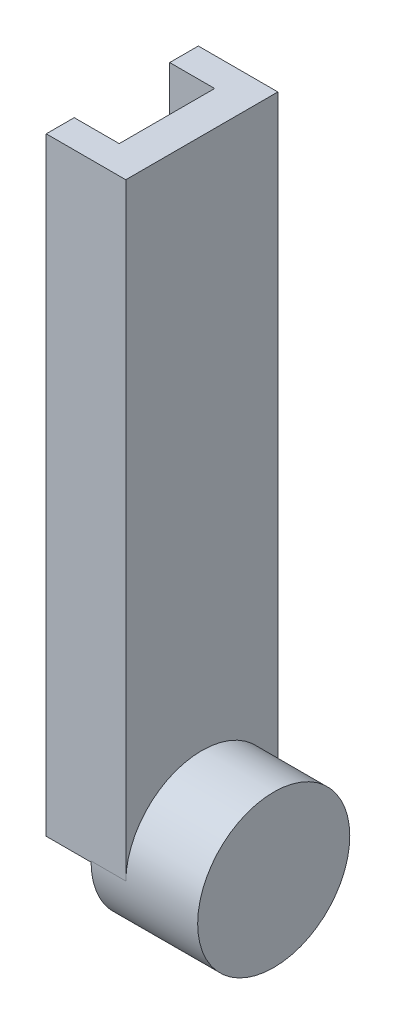
ISO-10303-21;
HEADER;
FILE_DESCRIPTION(('STEP AP214'),'2;1');
FILE_NAME('part.step','',(''),(''),'','','');
FILE_SCHEMA(('AUTOMOTIVE_DESIGN { 1 0 10303 214 1 1 1 1 }'));
ENDSEC;
DATA;
#1=APPLICATION_CONTEXT('core data for automotive mechanical design processes');
#2=APPLICATION_PROTOCOL_DEFINITION('international standard','automotive_design',2000,#1);
#3=PRODUCT_CONTEXT('',#1,'mechanical');
#4=PRODUCT('Part','Part','',(#3));
#5=PRODUCT_RELATED_PRODUCT_CATEGORY('part','',(#4));
#6=PRODUCT_DEFINITION_FORMATION('','',#4);
#7=PRODUCT_DEFINITION_CONTEXT('part definition',#1,'design');
#8=PRODUCT_DEFINITION('design','',#6,#7);
#9=PRODUCT_DEFINITION_SHAPE('','',#8);
#10=(LENGTH_UNIT() NAMED_UNIT(*) SI_UNIT(.MILLI.,.METRE.));
#11=(NAMED_UNIT(*) PLANE_ANGLE_UNIT() SI_UNIT($,.RADIAN.));
#12=(NAMED_UNIT(*) SI_UNIT($,.STERADIAN.) SOLID_ANGLE_UNIT());
#13=UNCERTAINTY_MEASURE_WITH_UNIT(LENGTH_MEASURE(1.E-05),#10,'distance_accuracy_value','');
#14=(GEOMETRIC_REPRESENTATION_CONTEXT(3) GLOBAL_UNCERTAINTY_ASSIGNED_CONTEXT((#13)) GLOBAL_UNIT_ASSIGNED_CONTEXT((#10,
#11,#12)) REPRESENTATION_CONTEXT('',''));
#15=CARTESIAN_POINT('',(0.,0.,0.));
#16=DIRECTION('',(0.,0.,1.));
#17=DIRECTION('',(1.,0.,0.));
#18=AXIS2_PLACEMENT_3D('',#15,#16,#17);
#19=CARTESIAN_POINT('',(14.,0.,0.));
#20=DIRECTION('',(-1.,0.,0.));
#21=DIRECTION('',(0.,0.,1.));
#22=AXIS2_PLACEMENT_3D('',#19,#20,#21);
#23=CYLINDRICAL_SURFACE('',#22,10.);
#24=CARTESIAN_POINT('',(14.,0.,0.));
#25=DIRECTION('',(1.,0.,0.));
#26=DIRECTION('',(0.,0.,-1.));
#27=AXIS2_PLACEMENT_3D('',#24,#25,#26);
#28=CIRCLE('',#27,10.);
#29=CARTESIAN_POINT('',(14.,0.,-10.));
#30=VERTEX_POINT('',#29);
#31=EDGE_CURVE('E168',#30,#30,#28,.T.);
#32=ORIENTED_EDGE('',*,*,#31,.F.);
#33=EDGE_LOOP('',(#32));
#34=FACE_BOUND('',#33,.T.);
#35=DIRECTION('',(-1.,0.,0.));
#36=VECTOR('',#35,1.);
#37=CARTESIAN_POINT('',(14.,0.137682640429803,9.9990521296033));
#38=LINE('',#37,#36);
#39=CARTESIAN_POINT('',(0.,0.137682640429803,9.9990521296033));
#40=VERTEX_POINT('',#39);
#41=CARTESIAN_POINT('',(4.54592595497942,0.137682640429806,9.9990521296033));
#42=VERTEX_POINT('',#41);
#43=EDGE_CURVE('E165',#40,#42,#38,.F.);
#44=ORIENTED_EDGE('',*,*,#43,.F.);
#45=CARTESIAN_POINT('',(0.,0.,0.));
#46=DIRECTION('',(1.,0.,0.));
#47=DIRECTION('',(0.,0.,-1.));
#48=AXIS2_PLACEMENT_3D('',#45,#46,#47);
#49=CIRCLE('',#48,10.);
#50=CARTESIAN_POINT('',(0.,0.,-10.));
#51=VERTEX_POINT('',#50);
#52=EDGE_CURVE('E167',#40,#51,#49,.T.);
#53=ORIENTED_EDGE('',*,*,#52,.T.);
#54=DIRECTION('',(-1.,0.,0.));
#55=VECTOR('',#54,1.);
#56=CARTESIAN_POINT('',(4.54592595497942,0.,-10.));
#57=LINE('',#56,#55);
#58=CARTESIAN_POINT('',(4.54592595497942,0.,-10.));
#59=VERTEX_POINT('',#58);
#60=EDGE_CURVE('E58',#59,#51,#57,.T.);
#61=ORIENTED_EDGE('',*,*,#60,.F.);
#62=CARTESIAN_POINT('',(4.54592595497942,0.,0.));
#63=DIRECTION('',(-1.,0.,0.));
#64=DIRECTION('',(0.,0.,1.));
#65=AXIS2_PLACEMENT_3D('',#62,#63,#64);
#66=CIRCLE('',#65,10.);
#67=EDGE_CURVE('E11',#42,#59,#66,.T.);
#68=ORIENTED_EDGE('',*,*,#67,.F.);
#69=EDGE_LOOP('',(#44,#53,#61,#68));
#70=FACE_BOUND('',#69,.T.);
#71=ADVANCED_FACE('F36',(#34,#70),#23,.T.);
#72=CARTESIAN_POINT('',(0.,0.,0.));
#73=DIRECTION('',(1.,0.,0.));
#74=DIRECTION('',(0.,0.,-1.));
#75=AXIS2_PLACEMENT_3D('',#72,#73,#74);
#76=PLANE('',#75);
#77=DIRECTION('',(0.,1.,0.));
#78=VECTOR('',#77,1.);
#79=CARTESIAN_POINT('',(0.,0.,9.9990521296033));
#80=LINE('',#79,#78);
#81=CARTESIAN_POINT('',(0.,0.,9.9990521296033));
#82=VERTEX_POINT('',#81);
#83=EDGE_CURVE('E43',#82,#40,#80,.T.);
#84=ORIENTED_EDGE('',*,*,#83,.F.);
#85=DIRECTION('',(0.,0.,-1.));
#86=VECTOR('',#85,1.);
#87=CARTESIAN_POINT('',(0.,0.,0.));
#88=LINE('',#87,#86);
#89=EDGE_CURVE('E171',#82,#51,#88,.T.);
#90=ORIENTED_EDGE('',*,*,#89,.T.);
#91=ORIENTED_EDGE('',*,*,#52,.F.);
#92=EDGE_LOOP('',(#84,#90,#91));
#93=FACE_BOUND('',#92,.T.);
#94=ADVANCED_FACE('F185',(#93),#76,.F.);
#95=CARTESIAN_POINT('',(14.,0.,0.));
#96=DIRECTION('',(1.,0.,0.));
#97=DIRECTION('',(0.,0.,-1.));
#98=AXIS2_PLACEMENT_3D('',#95,#96,#97);
#99=PLANE('',#98);
#100=ORIENTED_EDGE('',*,*,#31,.T.);
#101=EDGE_LOOP('',(#100));
#102=FACE_BOUND('',#101,.T.);
#103=ADVANCED_FACE('F227',(#102),#99,.T.);
#104=CARTESIAN_POINT('',(4.54592595497942,80.,9.9990521296033));
#105=DIRECTION('',(0.,0.,-1.));
#106=DIRECTION('',(-1.,0.,0.));
#107=AXIS2_PLACEMENT_3D('',#104,#105,#106);
#108=PLANE('',#107);
#109=ORIENTED_EDGE('',*,*,#83,.T.);
#110=ORIENTED_EDGE('',*,*,#43,.T.);
#111=DIRECTION('',(0.,-1.,0.));
#112=VECTOR('',#111,1.);
#113=CARTESIAN_POINT('',(4.54592595497942,80.,9.9990521296033));
#114=LINE('',#113,#112);
#115=CARTESIAN_POINT('',(4.54592595497942,80.,9.9990521296033));
#116=VERTEX_POINT('',#115);
#117=EDGE_CURVE('E148',#116,#42,#114,.T.);
#118=ORIENTED_EDGE('',*,*,#117,.F.);
#119=DIRECTION('',(1.,0.,0.));
#120=VECTOR('',#119,1.);
#121=CARTESIAN_POINT('',(4.54592595497942,80.,9.9990521296033));
#122=LINE('',#121,#120);
#123=CARTESIAN_POINT('',(-5.91333359481483,80.,9.9990521296033));
#124=VERTEX_POINT('',#123);
#125=EDGE_CURVE('E146',#124,#116,#122,.T.);
#126=ORIENTED_EDGE('',*,*,#125,.F.);
#127=DIRECTION('',(0.,-1.,0.));
#128=VECTOR('',#127,1.);
#129=CARTESIAN_POINT('',(-5.91333359481483,80.,9.9990521296033));
#130=LINE('',#129,#128);
#131=CARTESIAN_POINT('',(-5.91333359481483,0.,9.9990521296033));
#132=VERTEX_POINT('',#131);
#133=EDGE_CURVE('E157',#124,#132,#130,.T.);
#134=ORIENTED_EDGE('',*,*,#133,.T.);
#135=DIRECTION('',(1.,0.,0.));
#136=VECTOR('',#135,1.);
#137=CARTESIAN_POINT('',(4.54592595497942,0.,9.9990521296033));
#138=LINE('',#137,#136);
#139=EDGE_CURVE('E141',#132,#82,#138,.T.);
#140=ORIENTED_EDGE('',*,*,#139,.T.);
#141=EDGE_LOOP('',(#109,#110,#118,#126,#134,#140));
#142=FACE_BOUND('',#141,.T.);
#143=ADVANCED_FACE('F178',(#142),#108,.F.);
#144=CARTESIAN_POINT('',(0.,0.,0.));
#145=DIRECTION('',(0.,-1.,0.));
#146=DIRECTION('',(0.,0.,-1.));
#147=AXIS2_PLACEMENT_3D('',#144,#145,#146);
#148=PLANE('',#147);
#149=ORIENTED_EDGE('',*,*,#89,.F.);
#150=ORIENTED_EDGE('',*,*,#139,.F.);
#151=DIRECTION('',(0.,0.,1.));
#152=VECTOR('',#151,1.);
#153=CARTESIAN_POINT('',(-5.91333359481483,0.,-10.));
#154=LINE('',#153,#152);
#155=CARTESIAN_POINT('',(-5.91333359481483,0.,-10.));
#156=VERTEX_POINT('',#155);
#157=EDGE_CURVE('E150',#156,#132,#154,.T.);
#158=ORIENTED_EDGE('',*,*,#157,.F.);
#159=EDGE_CURVE('E151',#51,#156,#57,.T.);
#160=ORIENTED_EDGE('',*,*,#159,.F.);
#161=EDGE_LOOP('',(#149,#150,#158,#160));
#162=FACE_BOUND('',#161,.T.);
#163=ADVANCED_FACE('F187',(#162),#148,.T.);
#164=CARTESIAN_POINT('',(4.54592595497942,80.,-10.));
#165=DIRECTION('',(-1.,0.,0.));
#166=DIRECTION('',(0.,0.,1.));
#167=AXIS2_PLACEMENT_3D('',#164,#165,#166);
#168=PLANE('',#167);
#169=ORIENTED_EDGE('',*,*,#117,.T.);
#170=ORIENTED_EDGE('',*,*,#67,.T.);
#171=DIRECTION('',(0.,-1.,0.));
#172=VECTOR('',#171,1.);
#173=CARTESIAN_POINT('',(4.54592595497942,80.,-10.));
#174=LINE('',#173,#172);
#175=CARTESIAN_POINT('',(4.54592595497942,80.,-10.));
#176=VERTEX_POINT('',#175);
#177=EDGE_CURVE('E163',#176,#59,#174,.T.);
#178=ORIENTED_EDGE('',*,*,#177,.F.);
#179=DIRECTION('',(0.,0.,-1.));
#180=VECTOR('',#179,1.);
#181=CARTESIAN_POINT('',(4.54592595497942,80.,-10.));
#182=LINE('',#181,#180);
#183=EDGE_CURVE('E137',#116,#176,#182,.T.);
#184=ORIENTED_EDGE('',*,*,#183,.F.);
#185=EDGE_LOOP('',(#169,#170,#178,#184));
#186=FACE_BOUND('',#185,.T.);
#187=ADVANCED_FACE('F212',(#186),#168,.F.);
#188=CARTESIAN_POINT('',(4.54592595497942,80.,-10.));
#189=DIRECTION('',(0.,0.,1.));
#190=DIRECTION('',(1.,0.,0.));
#191=AXIS2_PLACEMENT_3D('',#188,#189,#190);
#192=PLANE('',#191);
#193=ORIENTED_EDGE('',*,*,#60,.T.);
#194=ORIENTED_EDGE('',*,*,#159,.T.);
#195=DIRECTION('',(0.,-1.,0.));
#196=VECTOR('',#195,1.);
#197=CARTESIAN_POINT('',(-5.91333359481483,80.,-10.));
#198=LINE('',#197,#196);
#199=CARTESIAN_POINT('',(-5.91333359481483,80.,-10.));
#200=VERTEX_POINT('',#199);
#201=EDGE_CURVE('E160',#200,#156,#198,.T.);
#202=ORIENTED_EDGE('',*,*,#201,.F.);
#203=DIRECTION('',(-1.,0.,0.));
#204=VECTOR('',#203,1.);
#205=CARTESIAN_POINT('',(4.54592595497942,80.,-10.));
#206=LINE('',#205,#204);
#207=EDGE_CURVE('E140',#176,#200,#206,.T.);
#208=ORIENTED_EDGE('',*,*,#207,.F.);
#209=ORIENTED_EDGE('',*,*,#177,.T.);
#210=EDGE_LOOP('',(#193,#194,#202,#208,#209));
#211=FACE_BOUND('',#210,.T.);
#212=ADVANCED_FACE('F207',(#211),#192,.F.);
#213=CARTESIAN_POINT('',(-5.91333359481483,80.,-10.));
#214=DIRECTION('',(1.,0.,0.));
#215=DIRECTION('',(0.,0.,-1.));
#216=AXIS2_PLACEMENT_3D('',#213,#214,#215);
#217=PLANE('',#216);
#218=DIRECTION('',(0.,0.,1.));
#219=VECTOR('',#218,1.);
#220=CARTESIAN_POINT('',(-5.91333359481483,25.,-6.23371869167769));
#221=LINE('',#220,#219);
#222=CARTESIAN_POINT('',(-5.91333359481483,25.,-6.23371869167769));
#223=VERTEX_POINT('',#222);
#224=CARTESIAN_POINT('',(-5.91333359481483,25.,6.31739276807541));
#225=VERTEX_POINT('',#224);
#226=EDGE_CURVE('E116',#223,#225,#221,.T.);
#227=ORIENTED_EDGE('',*,*,#226,.F.);
#228=DIRECTION('',(0.,1.,0.));
#229=VECTOR('',#228,1.);
#230=CARTESIAN_POINT('',(-5.91333359481483,25.,-6.23371869167769));
#231=LINE('',#230,#229);
#232=CARTESIAN_POINT('',(-5.91333359481483,80.,-6.23371869167769));
#233=VERTEX_POINT('',#232);
#234=EDGE_CURVE('E190',#223,#233,#231,.T.);
#235=ORIENTED_EDGE('',*,*,#234,.T.);
#236=DIRECTION('',(0.,0.,1.));
#237=VECTOR('',#236,1.);
#238=CARTESIAN_POINT('',(-5.91333359481483,80.,-10.));
#239=LINE('',#238,#237);
#240=EDGE_CURVE('E143',#200,#233,#239,.T.);
#241=ORIENTED_EDGE('',*,*,#240,.F.);
#242=ORIENTED_EDGE('',*,*,#201,.T.);
#243=ORIENTED_EDGE('',*,*,#157,.T.);
#244=ORIENTED_EDGE('',*,*,#133,.F.);
#245=CARTESIAN_POINT('',(-5.91333359481483,80.,6.31739276807541));
#246=VERTEX_POINT('',#245);
#247=EDGE_CURVE('E130',#246,#124,#239,.T.);
#248=ORIENTED_EDGE('',*,*,#247,.F.);
#249=DIRECTION('',(0.,1.,0.));
#250=VECTOR('',#249,1.);
#251=CARTESIAN_POINT('',(-5.91333359481483,25.,6.31739276807541));
#252=LINE('',#251,#250);
#253=EDGE_CURVE('E50',#225,#246,#252,.T.);
#254=ORIENTED_EDGE('',*,*,#253,.F.);
#255=EDGE_LOOP('',(#227,#235,#241,#242,#243,#244,#248,#254));
#256=FACE_BOUND('',#255,.T.);
#257=ADVANCED_FACE('F128',(#256),#217,.F.);
#258=CARTESIAN_POINT('',(0.,80.,0.));
#259=DIRECTION('',(0.,-1.,0.));
#260=DIRECTION('',(0.,0.,-1.));
#261=AXIS2_PLACEMENT_3D('',#258,#259,#260);
#262=PLANE('',#261);
#263=ORIENTED_EDGE('',*,*,#240,.T.);
#264=DIRECTION('',(-1.,0.,0.));
#265=VECTOR('',#264,1.);
#266=CARTESIAN_POINT('',(-5.91333359481483,80.,-6.23371869167769));
#267=LINE('',#266,#265);
#268=CARTESIAN_POINT('',(0.,80.,-6.23371869167769));
#269=VERTEX_POINT('',#268);
#270=EDGE_CURVE('E125',#269,#233,#267,.T.);
#271=ORIENTED_EDGE('',*,*,#270,.F.);
#272=DIRECTION('',(0.,0.,-1.));
#273=VECTOR('',#272,1.);
#274=CARTESIAN_POINT('',(0.,80.,-6.23371869167769));
#275=LINE('',#274,#273);
#276=CARTESIAN_POINT('',(0.,80.,6.31739276807541));
#277=VERTEX_POINT('',#276);
#278=EDGE_CURVE('E195',#277,#269,#275,.T.);
#279=ORIENTED_EDGE('',*,*,#278,.F.);
#280=DIRECTION('',(1.,0.,0.));
#281=VECTOR('',#280,1.);
#282=CARTESIAN_POINT('',(-5.91333359481483,80.,6.31739276807541));
#283=LINE('',#282,#281);
#284=EDGE_CURVE('E198',#246,#277,#283,.T.);
#285=ORIENTED_EDGE('',*,*,#284,.F.);
#286=ORIENTED_EDGE('',*,*,#247,.T.);
#287=ORIENTED_EDGE('',*,*,#125,.T.);
#288=ORIENTED_EDGE('',*,*,#183,.T.);
#289=ORIENTED_EDGE('',*,*,#207,.T.);
#290=EDGE_LOOP('',(#263,#271,#279,#285,#286,#287,#288,#289));
#291=FACE_BOUND('',#290,.T.);
#292=ADVANCED_FACE('F206',(#291),#262,.F.);
#293=CARTESIAN_POINT('',(-5.91333359481483,25.,-6.23371869167769));
#294=DIRECTION('',(0.,0.,-1.));
#295=DIRECTION('',(-1.,0.,0.));
#296=AXIS2_PLACEMENT_3D('',#293,#294,#295);
#297=PLANE('',#296);
#298=ORIENTED_EDGE('',*,*,#270,.T.);
#299=ORIENTED_EDGE('',*,*,#234,.F.);
#300=DIRECTION('',(-1.,0.,0.));
#301=VECTOR('',#300,1.);
#302=CARTESIAN_POINT('',(-5.91333359481483,25.,-6.23371869167769));
#303=LINE('',#302,#301);
#304=CARTESIAN_POINT('',(0.,25.,-6.23371869167769));
#305=VERTEX_POINT('',#304);
#306=EDGE_CURVE('E122',#305,#223,#303,.T.);
#307=ORIENTED_EDGE('',*,*,#306,.F.);
#308=DIRECTION('',(0.,1.,0.));
#309=VECTOR('',#308,1.);
#310=CARTESIAN_POINT('',(0.,25.,-6.23371869167769));
#311=LINE('',#310,#309);
#312=EDGE_CURVE('E132',#305,#269,#311,.T.);
#313=ORIENTED_EDGE('',*,*,#312,.T.);
#314=EDGE_LOOP('',(#298,#299,#307,#313));
#315=FACE_BOUND('',#314,.T.);
#316=ADVANCED_FACE('F202',(#315),#297,.F.);
#317=CARTESIAN_POINT('',(0.,25.,-6.23371869167769));
#318=DIRECTION('',(1.,0.,0.));
#319=DIRECTION('',(0.,0.,-1.));
#320=AXIS2_PLACEMENT_3D('',#317,#318,#319);
#321=PLANE('',#320);
#322=ORIENTED_EDGE('',*,*,#278,.T.);
#323=ORIENTED_EDGE('',*,*,#312,.F.);
#324=DIRECTION('',(0.,0.,-1.));
#325=VECTOR('',#324,1.);
#326=CARTESIAN_POINT('',(0.,25.,-6.23371869167769));
#327=LINE('',#326,#325);
#328=CARTESIAN_POINT('',(0.,25.,6.31739276807541));
#329=VERTEX_POINT('',#328);
#330=EDGE_CURVE('E115',#329,#305,#327,.T.);
#331=ORIENTED_EDGE('',*,*,#330,.F.);
#332=DIRECTION('',(0.,1.,0.));
#333=VECTOR('',#332,1.);
#334=CARTESIAN_POINT('',(0.,25.,6.31739276807541));
#335=LINE('',#334,#333);
#336=EDGE_CURVE('E111',#329,#277,#335,.T.);
#337=ORIENTED_EDGE('',*,*,#336,.T.);
#338=EDGE_LOOP('',(#322,#323,#331,#337));
#339=FACE_BOUND('',#338,.T.);
#340=ADVANCED_FACE('F246',(#339),#321,.F.);
#341=CARTESIAN_POINT('',(-5.91333359481483,25.,6.31739276807541));
#342=DIRECTION('',(0.,0.,1.));
#343=DIRECTION('',(1.,0.,0.));
#344=AXIS2_PLACEMENT_3D('',#341,#342,#343);
#345=PLANE('',#344);
#346=ORIENTED_EDGE('',*,*,#284,.T.);
#347=ORIENTED_EDGE('',*,*,#336,.F.);
#348=DIRECTION('',(1.,0.,0.));
#349=VECTOR('',#348,1.);
#350=CARTESIAN_POINT('',(-5.91333359481483,25.,6.31739276807541));
#351=LINE('',#350,#349);
#352=EDGE_CURVE('E108',#225,#329,#351,.T.);
#353=ORIENTED_EDGE('',*,*,#352,.F.);
#354=ORIENTED_EDGE('',*,*,#253,.T.);
#355=EDGE_LOOP('',(#346,#347,#353,#354));
#356=FACE_BOUND('',#355,.T.);
#357=ADVANCED_FACE('F110',(#356),#345,.F.);
#358=CARTESIAN_POINT('',(0.,25.,0.));
#359=DIRECTION('',(0.,1.,0.));
#360=DIRECTION('',(0.,0.,1.));
#361=AXIS2_PLACEMENT_3D('',#358,#359,#360);
#362=PLANE('',#361);
#363=ORIENTED_EDGE('',*,*,#226,.T.);
#364=ORIENTED_EDGE('',*,*,#352,.T.);
#365=ORIENTED_EDGE('',*,*,#330,.T.);
#366=ORIENTED_EDGE('',*,*,#306,.T.);
#367=EDGE_LOOP('',(#363,#364,#365,#366));
#368=FACE_BOUND('',#367,.T.);
#369=ADVANCED_FACE('F120',(#368),#362,.T.);
#370=CLOSED_SHELL('',(#71,#94,#103,#143,#163,#187,#212,#257,#292,#316,#340,#357,#369));
#371=MANIFOLD_SOLID_BREP('B2',#370);
#372=ADVANCED_BREP_SHAPE_REPRESENTATION('',(#18,#371),#14);
#373=SHAPE_DEFINITION_REPRESENTATION(#9,#372);
ENDSEC;
END-ISO-10303-21;
